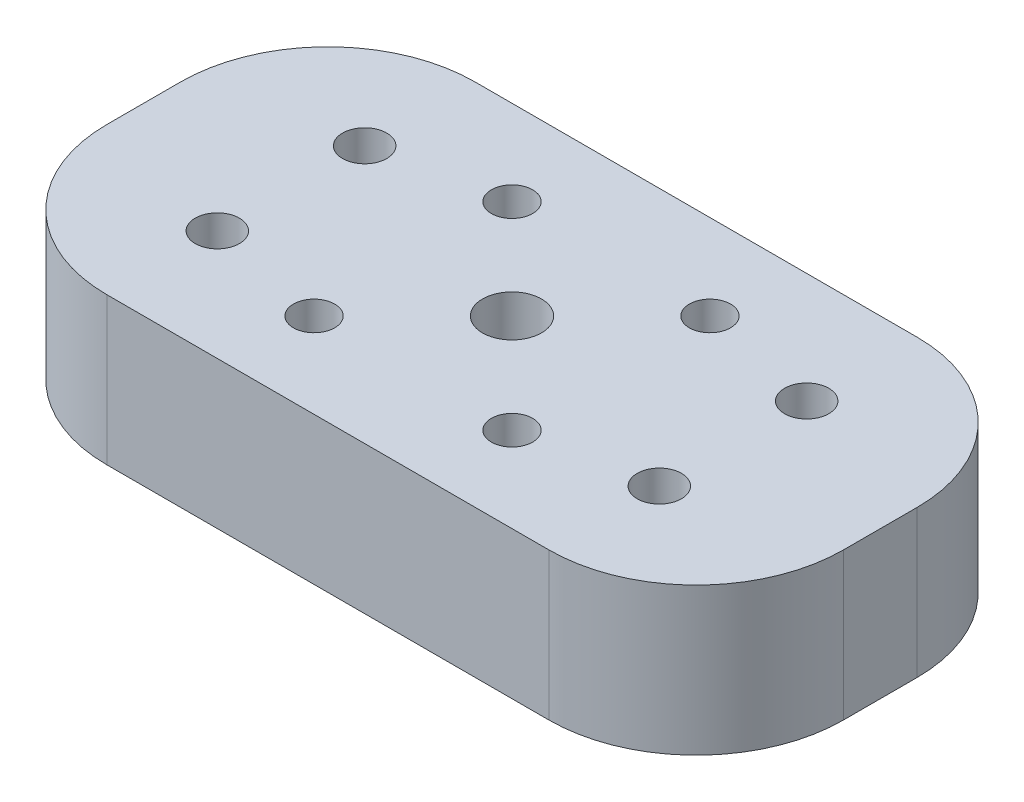
ISO-10303-21;
HEADER;
FILE_DESCRIPTION(('STEP AP214'),'2;1');
FILE_NAME('part.step','',(''),(''),'','','');
FILE_SCHEMA(('AUTOMOTIVE_DESIGN { 1 0 10303 214 1 1 1 1 }'));
ENDSEC;
DATA;
#1=APPLICATION_CONTEXT('core data for automotive mechanical design processes');
#2=APPLICATION_PROTOCOL_DEFINITION('international standard','automotive_design',2000,#1);
#3=PRODUCT_CONTEXT('',#1,'mechanical');
#4=PRODUCT('Part','Part','',(#3));
#5=PRODUCT_RELATED_PRODUCT_CATEGORY('part','',(#4));
#6=PRODUCT_DEFINITION_FORMATION('','',#4);
#7=PRODUCT_DEFINITION_CONTEXT('part definition',#1,'design');
#8=PRODUCT_DEFINITION('design','',#6,#7);
#9=PRODUCT_DEFINITION_SHAPE('','',#8);
#10=(LENGTH_UNIT() NAMED_UNIT(*) SI_UNIT(.MILLI.,.METRE.));
#11=(NAMED_UNIT(*) PLANE_ANGLE_UNIT() SI_UNIT($,.RADIAN.));
#12=(NAMED_UNIT(*) SI_UNIT($,.STERADIAN.) SOLID_ANGLE_UNIT());
#13=UNCERTAINTY_MEASURE_WITH_UNIT(LENGTH_MEASURE(1.E-05),#10,'distance_accuracy_value','');
#14=(GEOMETRIC_REPRESENTATION_CONTEXT(3) GLOBAL_UNCERTAINTY_ASSIGNED_CONTEXT((#13)) GLOBAL_UNIT_ASSIGNED_CONTEXT((#10,
#11,#12)) REPRESENTATION_CONTEXT('',''));
#15=CARTESIAN_POINT('',(0.,0.,0.));
#16=DIRECTION('',(0.,0.,1.));
#17=DIRECTION('',(1.,0.,0.));
#18=AXIS2_PLACEMENT_3D('',#15,#16,#17);
#19=CARTESIAN_POINT('',(-6.71751442127219,0.,6.71751442127221));
#20=DIRECTION('',(0.,1.,0.));
#21=DIRECTION('',(0.,0.,1.));
#22=AXIS2_PLACEMENT_3D('',#19,#20,#21);
#23=CYLINDRICAL_SURFACE('',#22,1.4);
#24=CARTESIAN_POINT('',(-6.71751442127219,10.,6.71751442127221));
#25=DIRECTION('',(0.,1.,0.));
#26=DIRECTION('',(0.,0.,1.));
#27=AXIS2_PLACEMENT_3D('',#24,#25,#26);
#28=CIRCLE('',#27,1.4);
#29=CARTESIAN_POINT('',(-6.71751442127219,10.,8.11751442127221));
#30=VERTEX_POINT('',#29);
#31=EDGE_CURVE('E189',#30,#30,#28,.T.);
#32=ORIENTED_EDGE('',*,*,#31,.T.);
#33=EDGE_LOOP('',(#32));
#34=FACE_BOUND('',#33,.T.);
#35=CARTESIAN_POINT('',(-6.71751442127219,4.,6.71751442127221));
#36=DIRECTION('',(0.,-1.,0.));
#37=DIRECTION('',(0.,0.,-1.));
#38=AXIS2_PLACEMENT_3D('',#35,#36,#37);
#39=CIRCLE('',#38,1.4);
#40=CARTESIAN_POINT('',(-6.71751442127219,4.,5.31751442127221));
#41=VERTEX_POINT('',#40);
#42=EDGE_CURVE('E45',#41,#41,#39,.F.);
#43=ORIENTED_EDGE('',*,*,#42,.F.);
#44=EDGE_LOOP('',(#43));
#45=FACE_BOUND('',#44,.T.);
#46=ADVANCED_FACE('F36',(#34,#45),#23,.F.);
#47=CARTESIAN_POINT('',(6.71751442127221,0.,6.71751442127219));
#48=DIRECTION('',(0.,1.,0.));
#49=DIRECTION('',(0.,0.,1.));
#50=AXIS2_PLACEMENT_3D('',#47,#48,#49);
#51=CYLINDRICAL_SURFACE('',#50,1.4);
#52=CARTESIAN_POINT('',(6.71751442127221,10.,6.71751442127219));
#53=DIRECTION('',(0.,1.,0.));
#54=DIRECTION('',(0.,0.,1.));
#55=AXIS2_PLACEMENT_3D('',#52,#53,#54);
#56=CIRCLE('',#55,1.4);
#57=CARTESIAN_POINT('',(6.71751442127221,10.,8.11751442127219));
#58=VERTEX_POINT('',#57);
#59=EDGE_CURVE('E188',#58,#58,#56,.T.);
#60=ORIENTED_EDGE('',*,*,#59,.T.);
#61=EDGE_LOOP('',(#60));
#62=FACE_BOUND('',#61,.T.);
#63=CARTESIAN_POINT('',(6.71751442127221,4.,6.71751442127219));
#64=DIRECTION('',(0.,-1.,0.));
#65=DIRECTION('',(0.,0.,-1.));
#66=AXIS2_PLACEMENT_3D('',#63,#64,#65);
#67=CIRCLE('',#66,1.4);
#68=CARTESIAN_POINT('',(6.71751442127221,4.,5.31751442127219));
#69=VERTEX_POINT('',#68);
#70=EDGE_CURVE('E169',#69,#69,#67,.F.);
#71=ORIENTED_EDGE('',*,*,#70,.F.);
#72=EDGE_LOOP('',(#71));
#73=FACE_BOUND('',#72,.T.);
#74=ADVANCED_FACE('F251',(#62,#73),#51,.F.);
#75=CARTESIAN_POINT('',(6.71751442127219,0.,-6.71751442127221));
#76=DIRECTION('',(0.,1.,0.));
#77=DIRECTION('',(0.,0.,1.));
#78=AXIS2_PLACEMENT_3D('',#75,#76,#77);
#79=CYLINDRICAL_SURFACE('',#78,1.4);
#80=CARTESIAN_POINT('',(6.71751442127219,10.,-6.71751442127221));
#81=DIRECTION('',(0.,1.,0.));
#82=DIRECTION('',(0.,0.,1.));
#83=AXIS2_PLACEMENT_3D('',#80,#81,#82);
#84=CIRCLE('',#83,1.4);
#85=CARTESIAN_POINT('',(6.71751442127219,10.,-5.31751442127221));
#86=VERTEX_POINT('',#85);
#87=EDGE_CURVE('E187',#86,#86,#84,.T.);
#88=ORIENTED_EDGE('',*,*,#87,.T.);
#89=EDGE_LOOP('',(#88));
#90=FACE_BOUND('',#89,.T.);
#91=CARTESIAN_POINT('',(6.71751442127219,4.,-6.71751442127221));
#92=DIRECTION('',(0.,-1.,0.));
#93=DIRECTION('',(0.,0.,-1.));
#94=AXIS2_PLACEMENT_3D('',#91,#92,#93);
#95=CIRCLE('',#94,1.4);
#96=CARTESIAN_POINT('',(6.71751442127219,4.,-8.11751442127221));
#97=VERTEX_POINT('',#96);
#98=EDGE_CURVE('E164',#97,#97,#95,.F.);
#99=ORIENTED_EDGE('',*,*,#98,.F.);
#100=EDGE_LOOP('',(#99));
#101=FACE_BOUND('',#100,.T.);
#102=ADVANCED_FACE('F257',(#90,#101),#79,.F.);
#103=CARTESIAN_POINT('',(-6.71751442127221,0.,-6.71751442127219));
#104=DIRECTION('',(0.,1.,0.));
#105=DIRECTION('',(0.,0.,1.));
#106=AXIS2_PLACEMENT_3D('',#103,#104,#105);
#107=CYLINDRICAL_SURFACE('',#106,1.4);
#108=CARTESIAN_POINT('',(-6.71751442127221,10.,-6.71751442127219));
#109=DIRECTION('',(0.,1.,0.));
#110=DIRECTION('',(0.,0.,1.));
#111=AXIS2_PLACEMENT_3D('',#108,#109,#110);
#112=CIRCLE('',#111,1.4);
#113=CARTESIAN_POINT('',(-6.71751442127221,10.,-5.31751442127219));
#114=VERTEX_POINT('',#113);
#115=EDGE_CURVE('E185',#114,#114,#112,.T.);
#116=ORIENTED_EDGE('',*,*,#115,.T.);
#117=EDGE_LOOP('',(#116));
#118=FACE_BOUND('',#117,.T.);
#119=CARTESIAN_POINT('',(-6.71751442127221,4.,-6.71751442127219));
#120=DIRECTION('',(0.,-1.,0.));
#121=DIRECTION('',(0.,0.,-1.));
#122=AXIS2_PLACEMENT_3D('',#119,#120,#121);
#123=CIRCLE('',#122,1.4);
#124=CARTESIAN_POINT('',(-6.71751442127221,4.,-8.11751442127219));
#125=VERTEX_POINT('',#124);
#126=EDGE_CURVE('E165',#125,#125,#123,.F.);
#127=ORIENTED_EDGE('',*,*,#126,.F.);
#128=EDGE_LOOP('',(#127));
#129=FACE_BOUND('',#128,.T.);
#130=ADVANCED_FACE('F249',(#118,#129),#107,.F.);
#131=CARTESIAN_POINT('',(-25.,10.,-12.5));
#132=DIRECTION('',(1.,0.,0.));
#133=DIRECTION('',(0.,0.,-1.));
#134=AXIS2_PLACEMENT_3D('',#131,#132,#133);
#135=PLANE('',#134);
#136=DIRECTION('',(0.,0.,1.));
#137=VECTOR('',#136,1.);
#138=CARTESIAN_POINT('',(-25.,0.,-12.5));
#139=LINE('',#138,#137);
#140=CARTESIAN_POINT('',(-25.,0.,-2.5));
#141=VERTEX_POINT('',#140);
#142=CARTESIAN_POINT('',(-25.,0.,2.5));
#143=VERTEX_POINT('',#142);
#144=EDGE_CURVE('E132',#141,#143,#139,.T.);
#145=ORIENTED_EDGE('',*,*,#144,.T.);
#146=DIRECTION('',(0.,-1.,0.));
#147=VECTOR('',#146,1.);
#148=CARTESIAN_POINT('',(-25.,10.,2.5));
#149=LINE('',#148,#147);
#150=CARTESIAN_POINT('',(-25.,10.,2.5));
#151=VERTEX_POINT('',#150);
#152=EDGE_CURVE('E158',#143,#151,#149,.F.);
#153=ORIENTED_EDGE('',*,*,#152,.T.);
#154=DIRECTION('',(0.,0.,1.));
#155=VECTOR('',#154,1.);
#156=CARTESIAN_POINT('',(-25.,10.,-12.5));
#157=LINE('',#156,#155);
#158=CARTESIAN_POINT('',(-25.,10.,-2.5));
#159=VERTEX_POINT('',#158);
#160=EDGE_CURVE('E131',#159,#151,#157,.T.);
#161=ORIENTED_EDGE('',*,*,#160,.F.);
#162=DIRECTION('',(0.,-1.,0.));
#163=VECTOR('',#162,1.);
#164=CARTESIAN_POINT('',(-25.,10.,-2.5));
#165=LINE('',#164,#163);
#166=EDGE_CURVE('E154',#159,#141,#165,.T.);
#167=ORIENTED_EDGE('',*,*,#166,.T.);
#168=EDGE_LOOP('',(#145,#153,#161,#167));
#169=FACE_BOUND('',#168,.T.);
#170=ADVANCED_FACE('F232',(#169),#135,.F.);
#171=CARTESIAN_POINT('',(25.,10.,12.5));
#172=DIRECTION('',(0.,0.,-1.));
#173=DIRECTION('',(-1.,0.,0.));
#174=AXIS2_PLACEMENT_3D('',#171,#172,#173);
#175=PLANE('',#174);
#176=DIRECTION('',(1.,0.,0.));
#177=VECTOR('',#176,1.);
#178=CARTESIAN_POINT('',(25.,0.,12.5));
#179=LINE('',#178,#177);
#180=CARTESIAN_POINT('',(-15.,0.,12.5));
#181=VERTEX_POINT('',#180);
#182=CARTESIAN_POINT('',(15.,0.,12.5));
#183=VERTEX_POINT('',#182);
#184=EDGE_CURVE('E133',#181,#183,#179,.T.);
#185=ORIENTED_EDGE('',*,*,#184,.T.);
#186=DIRECTION('',(0.,-1.,0.));
#187=VECTOR('',#186,1.);
#188=CARTESIAN_POINT('',(15.,10.,12.5));
#189=LINE('',#188,#187);
#190=CARTESIAN_POINT('',(15.,10.,12.5));
#191=VERTEX_POINT('',#190);
#192=EDGE_CURVE('E109',#183,#191,#189,.F.);
#193=ORIENTED_EDGE('',*,*,#192,.T.);
#194=DIRECTION('',(1.,0.,0.));
#195=VECTOR('',#194,1.);
#196=CARTESIAN_POINT('',(25.,10.,12.5));
#197=LINE('',#196,#195);
#198=CARTESIAN_POINT('',(-15.,10.,12.5));
#199=VERTEX_POINT('',#198);
#200=EDGE_CURVE('E224',#199,#191,#197,.T.);
#201=ORIENTED_EDGE('',*,*,#200,.F.);
#202=DIRECTION('',(0.,-1.,0.));
#203=VECTOR('',#202,1.);
#204=CARTESIAN_POINT('',(-15.,10.,12.5));
#205=LINE('',#204,#203);
#206=EDGE_CURVE('E113',#199,#181,#205,.T.);
#207=ORIENTED_EDGE('',*,*,#206,.T.);
#208=EDGE_LOOP('',(#185,#193,#201,#207));
#209=FACE_BOUND('',#208,.T.);
#210=ADVANCED_FACE('F243',(#209),#175,.F.);
#211=CARTESIAN_POINT('',(25.,10.,-12.5));
#212=DIRECTION('',(-1.,0.,0.));
#213=DIRECTION('',(0.,0.,1.));
#214=AXIS2_PLACEMENT_3D('',#211,#212,#213);
#215=PLANE('',#214);
#216=DIRECTION('',(0.,0.,-1.));
#217=VECTOR('',#216,1.);
#218=CARTESIAN_POINT('',(25.,10.,-12.5));
#219=LINE('',#218,#217);
#220=CARTESIAN_POINT('',(25.,10.,2.49999999999999));
#221=VERTEX_POINT('',#220);
#222=CARTESIAN_POINT('',(25.,10.,-2.50000000000001));
#223=VERTEX_POINT('',#222);
#224=EDGE_CURVE('E124',#221,#223,#219,.T.);
#225=ORIENTED_EDGE('',*,*,#224,.F.);
#226=DIRECTION('',(0.,-1.,0.));
#227=VECTOR('',#226,1.);
#228=CARTESIAN_POINT('',(25.,10.,2.49999999999999));
#229=LINE('',#228,#227);
#230=CARTESIAN_POINT('',(25.,0.,2.49999999999999));
#231=VERTEX_POINT('',#230);
#232=EDGE_CURVE('E108',#221,#231,#229,.T.);
#233=ORIENTED_EDGE('',*,*,#232,.T.);
#234=DIRECTION('',(0.,0.,-1.));
#235=VECTOR('',#234,1.);
#236=CARTESIAN_POINT('',(25.,0.,-12.5));
#237=LINE('',#236,#235);
#238=CARTESIAN_POINT('',(25.,0.,-2.50000000000001));
#239=VERTEX_POINT('',#238);
#240=EDGE_CURVE('E125',#231,#239,#237,.T.);
#241=ORIENTED_EDGE('',*,*,#240,.T.);
#242=DIRECTION('',(0.,-1.,0.));
#243=VECTOR('',#242,1.);
#244=CARTESIAN_POINT('',(25.,10.,-2.50000000000001));
#245=LINE('',#244,#243);
#246=EDGE_CURVE('E127',#239,#223,#245,.F.);
#247=ORIENTED_EDGE('',*,*,#246,.T.);
#248=EDGE_LOOP('',(#225,#233,#241,#247));
#249=FACE_BOUND('',#248,.T.);
#250=ADVANCED_FACE('F122',(#249),#215,.F.);
#251=CARTESIAN_POINT('',(25.,10.,-12.5));
#252=DIRECTION('',(0.,0.,1.));
#253=DIRECTION('',(1.,0.,0.));
#254=AXIS2_PLACEMENT_3D('',#251,#252,#253);
#255=PLANE('',#254);
#256=DIRECTION('',(-1.,0.,0.));
#257=VECTOR('',#256,1.);
#258=CARTESIAN_POINT('',(25.,0.,-12.5));
#259=LINE('',#258,#257);
#260=CARTESIAN_POINT('',(15.,0.,-12.5));
#261=VERTEX_POINT('',#260);
#262=CARTESIAN_POINT('',(-15.,0.,-12.5));
#263=VERTEX_POINT('',#262);
#264=EDGE_CURVE('E128',#261,#263,#259,.T.);
#265=ORIENTED_EDGE('',*,*,#264,.T.);
#266=DIRECTION('',(0.,-1.,0.));
#267=VECTOR('',#266,1.);
#268=CARTESIAN_POINT('',(-15.,10.,-12.5));
#269=LINE('',#268,#267);
#270=CARTESIAN_POINT('',(-15.,10.,-12.5));
#271=VERTEX_POINT('',#270);
#272=EDGE_CURVE('E11',#263,#271,#269,.F.);
#273=ORIENTED_EDGE('',*,*,#272,.T.);
#274=DIRECTION('',(-1.,0.,0.));
#275=VECTOR('',#274,1.);
#276=CARTESIAN_POINT('',(25.,10.,-12.5));
#277=LINE('',#276,#275);
#278=CARTESIAN_POINT('',(15.,10.,-12.5));
#279=VERTEX_POINT('',#278);
#280=EDGE_CURVE('E137',#279,#271,#277,.T.);
#281=ORIENTED_EDGE('',*,*,#280,.F.);
#282=DIRECTION('',(0.,-1.,0.));
#283=VECTOR('',#282,1.);
#284=CARTESIAN_POINT('',(15.,10.,-12.5));
#285=LINE('',#284,#283);
#286=EDGE_CURVE('E50',#279,#261,#285,.T.);
#287=ORIENTED_EDGE('',*,*,#286,.T.);
#288=EDGE_LOOP('',(#265,#273,#281,#287));
#289=FACE_BOUND('',#288,.T.);
#290=ADVANCED_FACE('F246',(#289),#255,.F.);
#291=CARTESIAN_POINT('',(0.,10.,0.));
#292=DIRECTION('',(0.,-1.,0.));
#293=DIRECTION('',(0.,0.,-1.));
#294=AXIS2_PLACEMENT_3D('',#291,#292,#293);
#295=PLANE('',#294);
#296=CARTESIAN_POINT('',(0.,10.,0.));
#297=DIRECTION('',(0.,1.,0.));
#298=DIRECTION('',(0.,0.,1.));
#299=AXIS2_PLACEMENT_3D('',#296,#297,#298);
#300=CIRCLE('',#299,2.);
#301=CARTESIAN_POINT('',(0.,10.,2.));
#302=VERTEX_POINT('',#301);
#303=EDGE_CURVE('E171',#302,#302,#300,.T.);
#304=ORIENTED_EDGE('',*,*,#303,.F.);
#305=EDGE_LOOP('',(#304));
#306=FACE_BOUND('',#305,.T.);
#307=ORIENTED_EDGE('',*,*,#115,.F.);
#308=EDGE_LOOP('',(#307));
#309=FACE_BOUND('',#308,.T.);
#310=ORIENTED_EDGE('',*,*,#87,.F.);
#311=EDGE_LOOP('',(#310));
#312=FACE_BOUND('',#311,.T.);
#313=ORIENTED_EDGE('',*,*,#59,.F.);
#314=EDGE_LOOP('',(#313));
#315=FACE_BOUND('',#314,.T.);
#316=ORIENTED_EDGE('',*,*,#31,.F.);
#317=EDGE_LOOP('',(#316));
#318=FACE_BOUND('',#317,.T.);
#319=CARTESIAN_POINT('',(15.,10.,-5.));
#320=DIRECTION('',(0.,1.,0.));
#321=DIRECTION('',(0.,0.,-1.));
#322=AXIS2_PLACEMENT_3D('',#319,#320,#321);
#323=CIRCLE('',#322,1.5);
#324=CARTESIAN_POINT('',(15.,10.,-6.5));
#325=VERTEX_POINT('',#324);
#326=EDGE_CURVE('E211',#325,#325,#323,.T.);
#327=ORIENTED_EDGE('',*,*,#326,.F.);
#328=EDGE_LOOP('',(#327));
#329=FACE_BOUND('',#328,.T.);
#330=CARTESIAN_POINT('',(15.,10.,5.));
#331=DIRECTION('',(0.,1.,0.));
#332=DIRECTION('',(0.,0.,-1.));
#333=AXIS2_PLACEMENT_3D('',#330,#331,#332);
#334=CIRCLE('',#333,1.5);
#335=CARTESIAN_POINT('',(15.,10.,3.5));
#336=VERTEX_POINT('',#335);
#337=EDGE_CURVE('E202',#336,#336,#334,.T.);
#338=ORIENTED_EDGE('',*,*,#337,.F.);
#339=EDGE_LOOP('',(#338));
#340=FACE_BOUND('',#339,.T.);
#341=CARTESIAN_POINT('',(-15.,10.,5.));
#342=DIRECTION('',(0.,1.,0.));
#343=DIRECTION('',(0.,0.,1.));
#344=AXIS2_PLACEMENT_3D('',#341,#342,#343);
#345=CIRCLE('',#344,1.5);
#346=CARTESIAN_POINT('',(-15.,10.,6.5));
#347=VERTEX_POINT('',#346);
#348=EDGE_CURVE('E196',#347,#347,#345,.T.);
#349=ORIENTED_EDGE('',*,*,#348,.F.);
#350=EDGE_LOOP('',(#349));
#351=FACE_BOUND('',#350,.T.);
#352=CARTESIAN_POINT('',(-15.,10.,-5.));
#353=DIRECTION('',(0.,1.,0.));
#354=DIRECTION('',(0.,0.,1.));
#355=AXIS2_PLACEMENT_3D('',#352,#353,#354);
#356=CIRCLE('',#355,1.5);
#357=CARTESIAN_POINT('',(-15.,10.,-3.5));
#358=VERTEX_POINT('',#357);
#359=EDGE_CURVE('E203',#358,#358,#356,.T.);
#360=ORIENTED_EDGE('',*,*,#359,.F.);
#361=EDGE_LOOP('',(#360));
#362=FACE_BOUND('',#361,.T.);
#363=ORIENTED_EDGE('',*,*,#200,.T.);
#364=CARTESIAN_POINT('',(15.,10.,2.5));
#365=DIRECTION('',(0.,-1.,0.));
#366=DIRECTION('',(0.,0.,-1.));
#367=AXIS2_PLACEMENT_3D('',#364,#365,#366);
#368=CIRCLE('',#367,10.);
#369=EDGE_CURVE('E153',#191,#221,#368,.F.);
#370=ORIENTED_EDGE('',*,*,#369,.T.);
#371=ORIENTED_EDGE('',*,*,#224,.T.);
#372=CARTESIAN_POINT('',(15.,10.,-2.50000000000001));
#373=DIRECTION('',(0.,-1.,0.));
#374=DIRECTION('',(0.,0.,-1.));
#375=AXIS2_PLACEMENT_3D('',#372,#373,#374);
#376=CIRCLE('',#375,10.);
#377=EDGE_CURVE('E58',#223,#279,#376,.F.);
#378=ORIENTED_EDGE('',*,*,#377,.T.);
#379=ORIENTED_EDGE('',*,*,#280,.T.);
#380=CARTESIAN_POINT('',(-15.,10.,-2.5));
#381=DIRECTION('',(0.,-1.,0.));
#382=DIRECTION('',(0.,0.,-1.));
#383=AXIS2_PLACEMENT_3D('',#380,#381,#382);
#384=CIRCLE('',#383,10.);
#385=EDGE_CURVE('E149',#271,#159,#384,.F.);
#386=ORIENTED_EDGE('',*,*,#385,.T.);
#387=ORIENTED_EDGE('',*,*,#160,.T.);
#388=CARTESIAN_POINT('',(-15.,10.,2.5));
#389=DIRECTION('',(0.,-1.,0.));
#390=DIRECTION('',(0.,0.,-1.));
#391=AXIS2_PLACEMENT_3D('',#388,#389,#390);
#392=CIRCLE('',#391,10.);
#393=EDGE_CURVE('E151',#151,#199,#392,.F.);
#394=ORIENTED_EDGE('',*,*,#393,.T.);
#395=EDGE_LOOP('',(#363,#370,#371,#378,#379,#386,#387,#394));
#396=FACE_BOUND('',#395,.T.);
#397=ADVANCED_FACE('F239',(#306,#309,#312,#315,#318,#329,#340,#351,#362,#396),#295,.F.);
#398=CARTESIAN_POINT('',(0.,0.,0.));
#399=DIRECTION('',(0.,-1.,0.));
#400=DIRECTION('',(0.,0.,-1.));
#401=AXIS2_PLACEMENT_3D('',#398,#399,#400);
#402=PLANE('',#401);
#403=CARTESIAN_POINT('',(-6.71751442127221,0.,-6.71751442127219));
#404=DIRECTION('',(0.,-1.,0.));
#405=DIRECTION('',(0.,0.,-1.));
#406=AXIS2_PLACEMENT_3D('',#403,#404,#405);
#407=CIRCLE('',#406,3.5);
#408=CARTESIAN_POINT('',(-6.71751442127221,0.,-10.2175144212722));
#409=VERTEX_POINT('',#408);
#410=EDGE_CURVE('E367',#409,#409,#407,.T.);
#411=ORIENTED_EDGE('',*,*,#410,.F.);
#412=EDGE_LOOP('',(#411));
#413=FACE_BOUND('',#412,.T.);
#414=CARTESIAN_POINT('',(6.71751442127219,0.,-6.71751442127221));
#415=DIRECTION('',(0.,-1.,0.));
#416=DIRECTION('',(0.,0.,-1.));
#417=AXIS2_PLACEMENT_3D('',#414,#415,#416);
#418=CIRCLE('',#417,3.5);
#419=CARTESIAN_POINT('',(6.71751442127219,0.,-10.2175144212722));
#420=VERTEX_POINT('',#419);
#421=EDGE_CURVE('E374',#420,#420,#418,.T.);
#422=ORIENTED_EDGE('',*,*,#421,.F.);
#423=EDGE_LOOP('',(#422));
#424=FACE_BOUND('',#423,.T.);
#425=CARTESIAN_POINT('',(6.71751442127221,0.,6.71751442127219));
#426=DIRECTION('',(0.,-1.,0.));
#427=DIRECTION('',(0.,0.,-1.));
#428=AXIS2_PLACEMENT_3D('',#425,#426,#427);
#429=CIRCLE('',#428,3.5);
#430=CARTESIAN_POINT('',(6.71751442127221,0.,3.21751442127219));
#431=VERTEX_POINT('',#430);
#432=EDGE_CURVE('E364',#431,#431,#429,.T.);
#433=ORIENTED_EDGE('',*,*,#432,.F.);
#434=EDGE_LOOP('',(#433));
#435=FACE_BOUND('',#434,.T.);
#436=CARTESIAN_POINT('',(-6.71751442127219,0.,6.71751442127221));
#437=DIRECTION('',(0.,-1.,0.));
#438=DIRECTION('',(0.,0.,-1.));
#439=AXIS2_PLACEMENT_3D('',#436,#437,#438);
#440=CIRCLE('',#439,3.5);
#441=CARTESIAN_POINT('',(-6.71751442127219,0.,3.21751442127221));
#442=VERTEX_POINT('',#441);
#443=EDGE_CURVE('E362',#442,#442,#440,.T.);
#444=ORIENTED_EDGE('',*,*,#443,.F.);
#445=EDGE_LOOP('',(#444));
#446=FACE_BOUND('',#445,.T.);
#447=CARTESIAN_POINT('',(0.,0.,0.));
#448=DIRECTION('',(0.,1.,0.));
#449=DIRECTION('',(0.,0.,1.));
#450=AXIS2_PLACEMENT_3D('',#447,#448,#449);
#451=CIRCLE('',#450,2.);
#452=CARTESIAN_POINT('',(0.,0.,2.));
#453=VERTEX_POINT('',#452);
#454=EDGE_CURVE('E180',#453,#453,#451,.T.);
#455=ORIENTED_EDGE('',*,*,#454,.T.);
#456=EDGE_LOOP('',(#455));
#457=FACE_BOUND('',#456,.T.);
#458=CARTESIAN_POINT('',(15.,0.,-5.));
#459=DIRECTION('',(0.,1.,0.));
#460=DIRECTION('',(0.,0.,-1.));
#461=AXIS2_PLACEMENT_3D('',#458,#459,#460);
#462=CIRCLE('',#461,1.5);
#463=CARTESIAN_POINT('',(15.,0.,-6.5));
#464=VERTEX_POINT('',#463);
#465=EDGE_CURVE('E197',#464,#464,#462,.T.);
#466=ORIENTED_EDGE('',*,*,#465,.T.);
#467=EDGE_LOOP('',(#466));
#468=FACE_BOUND('',#467,.T.);
#469=CARTESIAN_POINT('',(15.,0.,5.));
#470=DIRECTION('',(0.,1.,0.));
#471=DIRECTION('',(0.,0.,-1.));
#472=AXIS2_PLACEMENT_3D('',#469,#470,#471);
#473=CIRCLE('',#472,1.5);
#474=CARTESIAN_POINT('',(15.,0.,3.5));
#475=VERTEX_POINT('',#474);
#476=EDGE_CURVE('E208',#475,#475,#473,.T.);
#477=ORIENTED_EDGE('',*,*,#476,.T.);
#478=EDGE_LOOP('',(#477));
#479=FACE_BOUND('',#478,.T.);
#480=CARTESIAN_POINT('',(-15.,0.,5.));
#481=DIRECTION('',(0.,1.,0.));
#482=DIRECTION('',(0.,0.,1.));
#483=AXIS2_PLACEMENT_3D('',#480,#481,#482);
#484=CIRCLE('',#483,1.5);
#485=CARTESIAN_POINT('',(-15.,0.,6.5));
#486=VERTEX_POINT('',#485);
#487=EDGE_CURVE('E205',#486,#486,#484,.T.);
#488=ORIENTED_EDGE('',*,*,#487,.T.);
#489=EDGE_LOOP('',(#488));
#490=FACE_BOUND('',#489,.T.);
#491=CARTESIAN_POINT('',(-15.,0.,-5.));
#492=DIRECTION('',(0.,1.,0.));
#493=DIRECTION('',(0.,0.,1.));
#494=AXIS2_PLACEMENT_3D('',#491,#492,#493);
#495=CIRCLE('',#494,1.5);
#496=CARTESIAN_POINT('',(-15.,0.,-3.5));
#497=VERTEX_POINT('',#496);
#498=EDGE_CURVE('E216',#497,#497,#495,.T.);
#499=ORIENTED_EDGE('',*,*,#498,.T.);
#500=EDGE_LOOP('',(#499));
#501=FACE_BOUND('',#500,.T.);
#502=ORIENTED_EDGE('',*,*,#240,.F.);
#503=CARTESIAN_POINT('',(15.,0.,2.5));
#504=DIRECTION('',(0.,-1.,0.));
#505=DIRECTION('',(0.,0.,-1.));
#506=AXIS2_PLACEMENT_3D('',#503,#504,#505);
#507=CIRCLE('',#506,10.);
#508=EDGE_CURVE('E104',#231,#183,#507,.T.);
#509=ORIENTED_EDGE('',*,*,#508,.T.);
#510=ORIENTED_EDGE('',*,*,#184,.F.);
#511=CARTESIAN_POINT('',(-15.,0.,2.5));
#512=DIRECTION('',(0.,-1.,0.));
#513=DIRECTION('',(0.,0.,-1.));
#514=AXIS2_PLACEMENT_3D('',#511,#512,#513);
#515=CIRCLE('',#514,10.);
#516=EDGE_CURVE('E118',#181,#143,#515,.T.);
#517=ORIENTED_EDGE('',*,*,#516,.T.);
#518=ORIENTED_EDGE('',*,*,#144,.F.);
#519=CARTESIAN_POINT('',(-15.,0.,-2.5));
#520=DIRECTION('',(0.,-1.,0.));
#521=DIRECTION('',(0.,0.,-1.));
#522=AXIS2_PLACEMENT_3D('',#519,#520,#521);
#523=CIRCLE('',#522,10.);
#524=EDGE_CURVE('E142',#141,#263,#523,.T.);
#525=ORIENTED_EDGE('',*,*,#524,.T.);
#526=ORIENTED_EDGE('',*,*,#264,.F.);
#527=CARTESIAN_POINT('',(15.,0.,-2.50000000000001));
#528=DIRECTION('',(0.,-1.,0.));
#529=DIRECTION('',(0.,0.,-1.));
#530=AXIS2_PLACEMENT_3D('',#527,#528,#529);
#531=CIRCLE('',#530,10.);
#532=EDGE_CURVE('E121',#261,#239,#531,.T.);
#533=ORIENTED_EDGE('',*,*,#532,.T.);
#534=EDGE_LOOP('',(#502,#509,#510,#517,#518,#525,#526,#533));
#535=FACE_BOUND('',#534,.T.);
#536=ADVANCED_FACE('F126',(#413,#424,#435,#446,#457,#468,#479,#490,#501,#535),#402,.T.);
#537=CARTESIAN_POINT('',(-15.,0.,-5.));
#538=DIRECTION('',(0.,1.,0.));
#539=DIRECTION('',(0.,0.,1.));
#540=AXIS2_PLACEMENT_3D('',#537,#538,#539);
#541=CYLINDRICAL_SURFACE('',#540,1.5);
#542=ORIENTED_EDGE('',*,*,#498,.F.);
#543=EDGE_LOOP('',(#542));
#544=FACE_BOUND('',#543,.T.);
#545=ORIENTED_EDGE('',*,*,#359,.T.);
#546=EDGE_LOOP('',(#545));
#547=FACE_BOUND('',#546,.T.);
#548=ADVANCED_FACE('F271',(#544,#547),#541,.F.);
#549=CARTESIAN_POINT('',(-15.,0.,5.));
#550=DIRECTION('',(0.,1.,0.));
#551=DIRECTION('',(0.,0.,1.));
#552=AXIS2_PLACEMENT_3D('',#549,#550,#551);
#553=CYLINDRICAL_SURFACE('',#552,1.5);
#554=ORIENTED_EDGE('',*,*,#487,.F.);
#555=EDGE_LOOP('',(#554));
#556=FACE_BOUND('',#555,.T.);
#557=ORIENTED_EDGE('',*,*,#348,.T.);
#558=EDGE_LOOP('',(#557));
#559=FACE_BOUND('',#558,.T.);
#560=ADVANCED_FACE('F270',(#556,#559),#553,.F.);
#561=CARTESIAN_POINT('',(15.,0.,5.));
#562=DIRECTION('',(0.,1.,0.));
#563=DIRECTION('',(0.,0.,1.));
#564=AXIS2_PLACEMENT_3D('',#561,#562,#563);
#565=CYLINDRICAL_SURFACE('',#564,1.5);
#566=ORIENTED_EDGE('',*,*,#476,.F.);
#567=EDGE_LOOP('',(#566));
#568=FACE_BOUND('',#567,.T.);
#569=ORIENTED_EDGE('',*,*,#337,.T.);
#570=EDGE_LOOP('',(#569));
#571=FACE_BOUND('',#570,.T.);
#572=ADVANCED_FACE('F269',(#568,#571),#565,.F.);
#573=CARTESIAN_POINT('',(15.,0.,-5.));
#574=DIRECTION('',(0.,1.,0.));
#575=DIRECTION('',(0.,0.,1.));
#576=AXIS2_PLACEMENT_3D('',#573,#574,#575);
#577=CYLINDRICAL_SURFACE('',#576,1.5);
#578=ORIENTED_EDGE('',*,*,#465,.F.);
#579=EDGE_LOOP('',(#578));
#580=FACE_BOUND('',#579,.T.);
#581=ORIENTED_EDGE('',*,*,#326,.T.);
#582=EDGE_LOOP('',(#581));
#583=FACE_BOUND('',#582,.T.);
#584=ADVANCED_FACE('F274',(#580,#583),#577,.F.);
#585=CARTESIAN_POINT('',(0.,0.,0.));
#586=DIRECTION('',(0.,1.,0.));
#587=DIRECTION('',(0.,0.,1.));
#588=AXIS2_PLACEMENT_3D('',#585,#586,#587);
#589=CYLINDRICAL_SURFACE('',#588,2.);
#590=ORIENTED_EDGE('',*,*,#454,.F.);
#591=EDGE_LOOP('',(#590));
#592=FACE_BOUND('',#591,.T.);
#593=ORIENTED_EDGE('',*,*,#303,.T.);
#594=EDGE_LOOP('',(#593));
#595=FACE_BOUND('',#594,.T.);
#596=ADVANCED_FACE('F276',(#592,#595),#589,.F.);
#597=CARTESIAN_POINT('',(15.,10.,2.5));
#598=DIRECTION('',(0.,-1.,0.));
#599=DIRECTION('',(0.,0.,-1.));
#600=AXIS2_PLACEMENT_3D('',#597,#598,#599);
#601=CYLINDRICAL_SURFACE('',#600,10.);
#602=ORIENTED_EDGE('',*,*,#369,.F.);
#603=ORIENTED_EDGE('',*,*,#192,.F.);
#604=ORIENTED_EDGE('',*,*,#508,.F.);
#605=ORIENTED_EDGE('',*,*,#232,.F.);
#606=EDGE_LOOP('',(#602,#603,#604,#605));
#607=FACE_BOUND('',#606,.T.);
#608=ADVANCED_FACE('F107',(#607),#601,.T.);
#609=CARTESIAN_POINT('',(-15.,10.,2.5));
#610=DIRECTION('',(0.,-1.,0.));
#611=DIRECTION('',(0.,0.,-1.));
#612=AXIS2_PLACEMENT_3D('',#609,#610,#611);
#613=CYLINDRICAL_SURFACE('',#612,10.);
#614=ORIENTED_EDGE('',*,*,#393,.F.);
#615=ORIENTED_EDGE('',*,*,#152,.F.);
#616=ORIENTED_EDGE('',*,*,#516,.F.);
#617=ORIENTED_EDGE('',*,*,#206,.F.);
#618=EDGE_LOOP('',(#614,#615,#616,#617));
#619=FACE_BOUND('',#618,.T.);
#620=ADVANCED_FACE('F237',(#619),#613,.T.);
#621=CARTESIAN_POINT('',(-15.,10.,-2.5));
#622=DIRECTION('',(0.,-1.,0.));
#623=DIRECTION('',(0.,0.,-1.));
#624=AXIS2_PLACEMENT_3D('',#621,#622,#623);
#625=CYLINDRICAL_SURFACE('',#624,10.);
#626=ORIENTED_EDGE('',*,*,#385,.F.);
#627=ORIENTED_EDGE('',*,*,#272,.F.);
#628=ORIENTED_EDGE('',*,*,#524,.F.);
#629=ORIENTED_EDGE('',*,*,#166,.F.);
#630=EDGE_LOOP('',(#626,#627,#628,#629));
#631=FACE_BOUND('',#630,.T.);
#632=ADVANCED_FACE('F298',(#631),#625,.T.);
#633=CARTESIAN_POINT('',(15.,10.,-2.50000000000001));
#634=DIRECTION('',(0.,-1.,0.));
#635=DIRECTION('',(0.,0.,-1.));
#636=AXIS2_PLACEMENT_3D('',#633,#634,#635);
#637=CYLINDRICAL_SURFACE('',#636,10.);
#638=ORIENTED_EDGE('',*,*,#377,.F.);
#639=ORIENTED_EDGE('',*,*,#246,.F.);
#640=ORIENTED_EDGE('',*,*,#532,.F.);
#641=ORIENTED_EDGE('',*,*,#286,.F.);
#642=EDGE_LOOP('',(#638,#639,#640,#641));
#643=FACE_BOUND('',#642,.T.);
#644=ADVANCED_FACE('F37',(#643),#637,.T.);
#645=CARTESIAN_POINT('',(-6.71751442127221,4.,-6.71751442127219));
#646=DIRECTION('',(0.,-1.,0.));
#647=DIRECTION('',(0.,0.,-1.));
#648=AXIS2_PLACEMENT_3D('',#645,#646,#647);
#649=PLANE('',#648);
#650=CARTESIAN_POINT('',(-6.71751442127221,4.,-6.71751442127219));
#651=DIRECTION('',(0.,-1.,0.));
#652=DIRECTION('',(0.,0.,-1.));
#653=AXIS2_PLACEMENT_3D('',#650,#651,#652);
#654=CIRCLE('',#653,3.5);
#655=CARTESIAN_POINT('',(-6.71751442127221,4.,-10.2175144212722));
#656=VERTEX_POINT('',#655);
#657=EDGE_CURVE('E370',#656,#656,#654,.T.);
#658=ORIENTED_EDGE('',*,*,#657,.T.);
#659=EDGE_LOOP('',(#658));
#660=FACE_BOUND('',#659,.T.);
#661=ORIENTED_EDGE('',*,*,#126,.T.);
#662=EDGE_LOOP('',(#661));
#663=FACE_BOUND('',#662,.T.);
#664=ADVANCED_FACE('F296',(#660,#663),#649,.T.);
#665=CARTESIAN_POINT('',(-6.71751442127221,4.,-6.71751442127219));
#666=DIRECTION('',(0.,-1.,0.));
#667=DIRECTION('',(0.,0.,-1.));
#668=AXIS2_PLACEMENT_3D('',#665,#666,#667);
#669=CYLINDRICAL_SURFACE('',#668,3.5);
#670=ORIENTED_EDGE('',*,*,#657,.F.);
#671=EDGE_LOOP('',(#670));
#672=FACE_BOUND('',#671,.T.);
#673=ORIENTED_EDGE('',*,*,#410,.T.);
#674=EDGE_LOOP('',(#673));
#675=FACE_BOUND('',#674,.T.);
#676=ADVANCED_FACE('F301',(#672,#675),#669,.F.);
#677=CARTESIAN_POINT('',(6.71751442127219,4.,-6.71751442127221));
#678=DIRECTION('',(0.,-1.,0.));
#679=DIRECTION('',(0.,0.,-1.));
#680=AXIS2_PLACEMENT_3D('',#677,#678,#679);
#681=PLANE('',#680);
#682=CARTESIAN_POINT('',(6.71751442127219,4.,-6.71751442127221));
#683=DIRECTION('',(0.,-1.,0.));
#684=DIRECTION('',(0.,0.,-1.));
#685=AXIS2_PLACEMENT_3D('',#682,#683,#684);
#686=CIRCLE('',#685,3.5);
#687=CARTESIAN_POINT('',(6.71751442127219,4.,-10.2175144212722));
#688=VERTEX_POINT('',#687);
#689=EDGE_CURVE('E373',#688,#688,#686,.T.);
#690=ORIENTED_EDGE('',*,*,#689,.T.);
#691=EDGE_LOOP('',(#690));
#692=FACE_BOUND('',#691,.T.);
#693=ORIENTED_EDGE('',*,*,#98,.T.);
#694=EDGE_LOOP('',(#693));
#695=FACE_BOUND('',#694,.T.);
#696=ADVANCED_FACE('F334',(#692,#695),#681,.T.);
#697=CARTESIAN_POINT('',(6.71751442127219,4.,-6.71751442127221));
#698=DIRECTION('',(0.,-1.,0.));
#699=DIRECTION('',(0.,0.,-1.));
#700=AXIS2_PLACEMENT_3D('',#697,#698,#699);
#701=CYLINDRICAL_SURFACE('',#700,3.5);
#702=ORIENTED_EDGE('',*,*,#689,.F.);
#703=EDGE_LOOP('',(#702));
#704=FACE_BOUND('',#703,.T.);
#705=ORIENTED_EDGE('',*,*,#421,.T.);
#706=EDGE_LOOP('',(#705));
#707=FACE_BOUND('',#706,.T.);
#708=ADVANCED_FACE('F333',(#704,#707),#701,.F.);
#709=CARTESIAN_POINT('',(6.71751442127221,4.,6.71751442127219));
#710=DIRECTION('',(0.,-1.,0.));
#711=DIRECTION('',(0.,0.,-1.));
#712=AXIS2_PLACEMENT_3D('',#709,#710,#711);
#713=PLANE('',#712);
#714=CARTESIAN_POINT('',(6.71751442127221,4.,6.71751442127219));
#715=DIRECTION('',(0.,-1.,0.));
#716=DIRECTION('',(0.,0.,-1.));
#717=AXIS2_PLACEMENT_3D('',#714,#715,#716);
#718=CIRCLE('',#717,3.5);
#719=CARTESIAN_POINT('',(6.71751442127221,4.,3.21751442127219));
#720=VERTEX_POINT('',#719);
#721=EDGE_CURVE('E378',#720,#720,#718,.T.);
#722=ORIENTED_EDGE('',*,*,#721,.T.);
#723=EDGE_LOOP('',(#722));
#724=FACE_BOUND('',#723,.T.);
#725=ORIENTED_EDGE('',*,*,#70,.T.);
#726=EDGE_LOOP('',(#725));
#727=FACE_BOUND('',#726,.T.);
#728=ADVANCED_FACE('F345',(#724,#727),#713,.T.);
#729=CARTESIAN_POINT('',(6.71751442127221,4.,6.71751442127219));
#730=DIRECTION('',(0.,-1.,0.));
#731=DIRECTION('',(0.,0.,-1.));
#732=AXIS2_PLACEMENT_3D('',#729,#730,#731);
#733=CYLINDRICAL_SURFACE('',#732,3.5);
#734=ORIENTED_EDGE('',*,*,#721,.F.);
#735=EDGE_LOOP('',(#734));
#736=FACE_BOUND('',#735,.T.);
#737=ORIENTED_EDGE('',*,*,#432,.T.);
#738=EDGE_LOOP('',(#737));
#739=FACE_BOUND('',#738,.T.);
#740=ADVANCED_FACE('F353',(#736,#739),#733,.F.);
#741=CARTESIAN_POINT('',(-6.71751442127219,4.,6.71751442127221));
#742=DIRECTION('',(0.,-1.,0.));
#743=DIRECTION('',(0.,0.,-1.));
#744=AXIS2_PLACEMENT_3D('',#741,#742,#743);
#745=PLANE('',#744);
#746=CARTESIAN_POINT('',(-6.71751442127219,4.,6.71751442127221));
#747=DIRECTION('',(0.,-1.,0.));
#748=DIRECTION('',(0.,0.,-1.));
#749=AXIS2_PLACEMENT_3D('',#746,#747,#748);
#750=CIRCLE('',#749,3.5);
#751=CARTESIAN_POINT('',(-6.71751442127219,4.,3.21751442127221));
#752=VERTEX_POINT('',#751);
#753=EDGE_CURVE('E167',#752,#752,#750,.T.);
#754=ORIENTED_EDGE('',*,*,#753,.T.);
#755=EDGE_LOOP('',(#754));
#756=FACE_BOUND('',#755,.T.);
#757=ORIENTED_EDGE('',*,*,#42,.T.);
#758=EDGE_LOOP('',(#757));
#759=FACE_BOUND('',#758,.T.);
#760=ADVANCED_FACE('F349',(#756,#759),#745,.T.);
#761=CARTESIAN_POINT('',(-6.71751442127219,4.,6.71751442127221));
#762=DIRECTION('',(0.,-1.,0.));
#763=DIRECTION('',(0.,0.,-1.));
#764=AXIS2_PLACEMENT_3D('',#761,#762,#763);
#765=CYLINDRICAL_SURFACE('',#764,3.5);
#766=ORIENTED_EDGE('',*,*,#753,.F.);
#767=EDGE_LOOP('',(#766));
#768=FACE_BOUND('',#767,.T.);
#769=ORIENTED_EDGE('',*,*,#443,.T.);
#770=EDGE_LOOP('',(#769));
#771=FACE_BOUND('',#770,.T.);
#772=ADVANCED_FACE('F321',(#768,#771),#765,.F.);
#773=CLOSED_SHELL('',(#46,#74,#102,#130,#170,#210,#250,#290,#397,#536,#548,#560,#572,#584,#596,
#608,#620,#632,#644,#664,#676,#696,#708,#728,#740,#760,#772));
#774=MANIFOLD_SOLID_BREP('B2',#773);
#775=ADVANCED_BREP_SHAPE_REPRESENTATION('',(#18,#774),#14);
#776=SHAPE_DEFINITION_REPRESENTATION(#9,#775);
ENDSEC;
END-ISO-10303-21;
